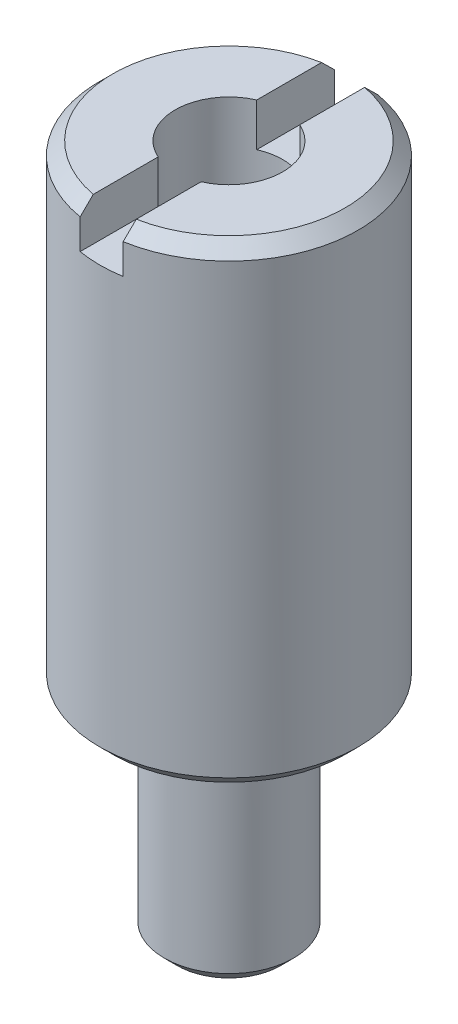
ISO-10303-21;
HEADER;
FILE_DESCRIPTION(('STEP AP214'),'2;1');
FILE_NAME('part.step','',(''),(''),'','','');
FILE_SCHEMA(('AUTOMOTIVE_DESIGN { 1 0 10303 214 1 1 1 1 }'));
ENDSEC;
DATA;
#1=APPLICATION_CONTEXT('core data for automotive mechanical design processes');
#2=APPLICATION_PROTOCOL_DEFINITION('international standard','automotive_design',2000,#1);
#3=PRODUCT_CONTEXT('',#1,'mechanical');
#4=PRODUCT('Part','Part','',(#3));
#5=PRODUCT_RELATED_PRODUCT_CATEGORY('part','',(#4));
#6=PRODUCT_DEFINITION_FORMATION('','',#4);
#7=PRODUCT_DEFINITION_CONTEXT('part definition',#1,'design');
#8=PRODUCT_DEFINITION('design','',#6,#7);
#9=PRODUCT_DEFINITION_SHAPE('','',#8);
#10=(LENGTH_UNIT() NAMED_UNIT(*) SI_UNIT(.MILLI.,.METRE.));
#11=(NAMED_UNIT(*) PLANE_ANGLE_UNIT() SI_UNIT($,.RADIAN.));
#12=(NAMED_UNIT(*) SI_UNIT($,.STERADIAN.) SOLID_ANGLE_UNIT());
#13=UNCERTAINTY_MEASURE_WITH_UNIT(LENGTH_MEASURE(1.E-05),#10,'distance_accuracy_value','');
#14=(GEOMETRIC_REPRESENTATION_CONTEXT(3) GLOBAL_UNCERTAINTY_ASSIGNED_CONTEXT((#13)) GLOBAL_UNIT_ASSIGNED_CONTEXT((#10,
#11,#12)) REPRESENTATION_CONTEXT('',''));
#15=CARTESIAN_POINT('',(0.,0.,0.));
#16=DIRECTION('',(0.,0.,1.));
#17=DIRECTION('',(1.,0.,0.));
#18=AXIS2_PLACEMENT_3D('',#15,#16,#17);
#19=CARTESIAN_POINT('',(0.499999999999999,10.,2.95803989154981));
#20=DIRECTION('',(1.,0.,0.));
#21=DIRECTION('',(0.,1.,0.));
#22=AXIS2_PLACEMENT_3D('',#19,#20,#21);
#23=PLANE('',#22);
#24=DIRECTION('',(0.,0.,-1.));
#25=VECTOR('',#24,1.);
#26=CARTESIAN_POINT('',(0.499999999999999,10.,2.95803989154981));
#27=LINE('',#26,#25);
#28=CARTESIAN_POINT('',(0.499999999999999,10.,-1.14564392373896));
#29=VERTEX_POINT('',#28);
#30=CARTESIAN_POINT('',(0.499999999999999,10.,-2.95803989154981));
#31=VERTEX_POINT('',#30);
#32=EDGE_CURVE('E158',#29,#31,#27,.T.);
#33=ORIENTED_EDGE('',*,*,#32,.F.);
#34=DIRECTION('',(0.,1.,0.));
#35=VECTOR('',#34,1.);
#36=CARTESIAN_POINT('',(0.499999999999999,11.,-1.14564392373896));
#37=LINE('',#36,#35);
#38=CARTESIAN_POINT('',(0.499999999999999,11.,-1.14564392373896));
#39=VERTEX_POINT('',#38);
#40=EDGE_CURVE('E62',#29,#39,#37,.T.);
#41=ORIENTED_EDGE('',*,*,#40,.T.);
#42=DIRECTION('',(0.,0.,-1.));
#43=VECTOR('',#42,1.);
#44=CARTESIAN_POINT('',(0.499999999999999,11.,2.95803989154981));
#45=LINE('',#44,#43);
#46=CARTESIAN_POINT('',(0.499999999999999,11.,-2.65329983228432));
#47=VERTEX_POINT('',#46);
#48=EDGE_CURVE('E166',#39,#47,#45,.T.);
#49=ORIENTED_EDGE('',*,*,#48,.T.);
#50=CARTESIAN_POINT('',(0.499999999999999,10.6993,2.95874981875792));
#51=CARTESIAN_POINT('',(0.499999999999999,10.6993032628081,2.95874650968862));
#52=CARTESIAN_POINT('',(0.499999999999999,10.6993065256161,2.95874320061925));
#53=CARTESIAN_POINT('',(0.499999999999999,10.8027276984309,2.85385567683524));
#54=CARTESIAN_POINT('',(0.499999999999999,10.9060691998332,2.74889605427455));
#55=CARTESIAN_POINT('',(0.499999999999999,11.1125531184051,2.53875236012268));
#56=CARTESIAN_POINT('',(0.499999999999999,11.2156955058096,2.43356825927909));
#57=CARTESIAN_POINT('',(0.499999999999999,11.4220322332499,2.22252850914309));
#58=CARTESIAN_POINT('',(0.499999999999999,11.5252254887443,2.11667179821652));
#59=CARTESIAN_POINT('',(0.499999999999999,11.7310623122136,1.90456567313246));
#60=CARTESIAN_POINT('',(0.499999999999999,11.8337062078894,1.79831657710221));
#61=CARTESIAN_POINT('',(0.499999999999999,12.0373956038889,1.58592959111794));
#62=CARTESIAN_POINT('',(0.499999999999999,12.1384473197591,1.47979768983355));
#63=CARTESIAN_POINT('',(0.499999999999999,12.2890986672922,1.31945809068823));
#64=CARTESIAN_POINT('',(0.499999999999999,12.339227916271,1.26574857588184));
#65=CARTESIAN_POINT('',(0.499999999999999,12.4389588879742,1.15786534379939));
#66=CARTESIAN_POINT('',(0.499999999999999,12.4885607394143,1.10369174589862));
#67=CARTESIAN_POINT('',(0.499999999999999,12.5865258163309,0.995170464365385));
#68=CARTESIAN_POINT('',(0.499999999999999,12.6348963473027,0.940829385805618));
#69=CARTESIAN_POINT('',(0.499999999999999,12.730507671738,0.831056850119869));
#70=CARTESIAN_POINT('',(0.499999999999999,12.7777473154931,0.775624379738064));
#71=CARTESIAN_POINT('',(0.499999999999999,12.8469522960314,0.691332594992195));
#72=CARTESIAN_POINT('',(0.499999999999999,12.8696936634733,0.663112069617232));
#73=CARTESIAN_POINT('',(0.499999999999999,12.9144666617805,0.606115196996294));
#74=CARTESIAN_POINT('',(0.499999999999999,12.936498374947,0.577338914827156));
#75=CARTESIAN_POINT('',(0.499999999999999,12.9795322116046,0.519094038068847));
#76=CARTESIAN_POINT('',(0.499999999999999,13.0005359177478,0.489626618070147));
#77=CARTESIAN_POINT('',(0.499999999999999,13.0410886324597,0.429712199658106));
#78=CARTESIAN_POINT('',(0.499999999999999,13.0606385043995,0.399265798261092));
#79=CARTESIAN_POINT('',(0.499999999999999,13.0841498965911,0.359608218911257));
#80=CARTESIAN_POINT('',(0.499999999999999,13.0891375772727,0.351003983426712));
#81=CARTESIAN_POINT('',(0.499999999999999,13.0989218690113,0.333685658966236));
#82=CARTESIAN_POINT('',(0.499999999999999,13.1037184473827,0.3249715515309));
#83=CARTESIAN_POINT('',(0.499999999999999,13.1177858455721,0.298652870723052));
#84=CARTESIAN_POINT('',(0.499999999999999,13.1267335942264,0.280873163487088));
#85=CARTESIAN_POINT('',(0.499999999999999,13.1434882940614,0.244863071225541));
#86=CARTESIAN_POINT('',(0.499999999999999,13.1512996276926,0.226634752577692));
#87=CARTESIAN_POINT('',(0.499999999999999,13.1655177242567,0.189639976675175));
#88=CARTESIAN_POINT('',(0.499999999999999,13.1719247701478,0.170873628694599));
#89=CARTESIAN_POINT('',(0.499999999999999,13.1858215875976,0.123026906237069));
#90=CARTESIAN_POINT('',(0.499999999999999,13.1921793304307,0.0935963250291287));
#91=CARTESIAN_POINT('',(0.499999999999999,13.1997039897745,0.0340722043892151));
#92=CARTESIAN_POINT('',(0.499999999999999,13.2008761363756,0.0039793637080151));
#93=CARTESIAN_POINT('',(0.499999999999999,13.1977775343522,-0.0558876253264694));
#94=CARTESIAN_POINT('',(0.499999999999999,13.1935103343496,-0.0856619686926777));
#95=CARTESIAN_POINT('',(0.499999999999999,13.1804135385953,-0.144190688790413));
#96=CARTESIAN_POINT('',(0.499999999999999,13.1715750054239,-0.172942949126156));
#97=CARTESIAN_POINT('',(0.499999999999999,13.1478712455945,-0.23650160631182));
#98=CARTESIAN_POINT('',(0.499999999999999,13.132035793255,-0.270933611560776));
#99=CARTESIAN_POINT('',(0.499999999999999,13.0970890618713,-0.338121893066516));
#100=CARTESIAN_POINT('',(0.499999999999999,13.0779702367288,-0.370874078295897));
#101=CARTESIAN_POINT('',(0.499999999999999,13.0375058838782,-0.435352694705371));
#102=CARTESIAN_POINT('',(0.499999999999999,13.0161423182041,-0.467067627645559));
#103=CARTESIAN_POINT('',(0.499999999999999,12.9720772652006,-0.529488419554599));
#104=CARTESIAN_POINT('',(0.499999999999999,12.949377298192,-0.560195365551938));
#105=CARTESIAN_POINT('',(0.499999999999999,12.9003266004614,-0.624466347620693));
#106=CARTESIAN_POINT('',(0.499999999999999,12.8738604549198,-0.657941759772862));
#107=CARTESIAN_POINT('',(0.499999999999999,12.820133587541,-0.724250819788516));
#108=CARTESIAN_POINT('',(0.499999999999999,12.792872775074,-0.75708439373293));
#109=CARTESIAN_POINT('',(0.499999999999999,12.7102371322897,-0.854905532693234));
#110=CARTESIAN_POINT('',(0.499999999999999,12.654029561248,-0.919187544765238));
#111=CARTESIAN_POINT('',(0.499999999999999,12.5403133601899,-1.04675322165754));
#112=CARTESIAN_POINT('',(0.499999999999999,12.4828028817197,-1.11003521972709));
#113=CARTESIAN_POINT('',(0.499999999999999,12.3670338431672,-1.23588309316743));
#114=CARTESIAN_POINT('',(0.499999999999999,12.3087754609212,-1.29844913232354));
#115=CARTESIAN_POINT('',(0.499999999999999,12.19201010214,-1.42284548240621));
#116=CARTESIAN_POINT('',(0.499999999999999,12.1335052515569,-1.48467779473466));
#117=CARTESIAN_POINT('',(0.499999999999999,12.0161467519171,-1.60801716247392));
#118=CARTESIAN_POINT('',(0.499999999999999,11.9572930824697,-1.66952419846447));
#119=CARTESIAN_POINT('',(0.499999999999999,11.7804500418028,-1.85360348601583));
#120=CARTESIAN_POINT('',(0.499999999999999,11.6620940980811,-1.97582333343631));
#121=CARTESIAN_POINT('',(0.499999999999999,11.4734173378781,-2.16977821240794));
#122=CARTESIAN_POINT('',(0.499999999999999,11.4032762685992,-2.24168866149541));
#123=CARTESIAN_POINT('',(0.499999999999999,11.2628344290932,-2.38537389780081));
#124=CARTESIAN_POINT('',(0.499999999999999,11.1925336371922,-2.4571486638447));
#125=CARTESIAN_POINT('',(0.499999999999999,10.9814178654449,-2.67235226850947));
#126=CARTESIAN_POINT('',(0.499999999999999,10.8404336807675,-2.8156150825727));
#127=CARTESIAN_POINT('',(0.499999999999999,10.6993065256161,-2.95874320061925));
#128=CARTESIAN_POINT('',(0.499999999999999,10.6993032628081,-2.95874650968862));
#129=CARTESIAN_POINT('',(0.499999999999999,10.6993,-2.95874981875792));
#130=B_SPLINE_CURVE_WITH_KNOTS('',3,(#50,#51,#52,#53,#54,#55,#56,#57,#58,#59,#60,#61,#62,#63,
#64,#65,#66,#67,#68,#69,#70,#71,#72,#73,#74,#75,#76,#77,#78,#79,#80,#81,#82,#83,#84,#85,#86,#87,
#88,#89,#90,#91,#92,#93,#94,#95,#96,#97,#98,#99,#100,#101,#102,#103,#104,#105,#106,#107,#108,
#109,#110,#111,#112,#113,#114,#115,#116,#117,#118,#119,#120,#121,#122,#123,#124,#125,#126,#127,
#128,#129),.UNSPECIFIED.,.F.,.F.,(4,2,2,2,2,2,2,2,2,2,2,2,2,2,2,2,2,2,2,2,2,2,2,2,2,2,2,2,2,2,2,
2,2,2,2,2,2,2,2,4),(0.,1.39414025392382E-05,0.441900423945657,0.883848514114979,
1.32734532183282,1.77053878390516,2.21016490675432,2.43056904678594,2.6509181002222,
2.86916249458226,3.08762007515377,3.19634206310899,3.30505139644135,3.41358773431733,
3.52205909358646,3.55189302705182,3.58173204148662,3.64141434978097,3.7008600256394,
3.76029371239986,3.85023128461419,3.94007812684971,4.02986638312051,4.11983085185914,
4.23323467850673,4.34690271451209,4.46156643350439,4.57610213872126,4.70410587884228,
4.83212427503449,5.08826019644389,5.3447856044602,5.60125110596169,5.85662073164685,
6.11200543555282,6.62240569418031,6.92376580006528,7.22516958617061,7.82816707820471,
7.82818101960724),.UNSPECIFIED.);
#131=CARTESIAN_POINT('',(0.499999999999999,10.7,-2.95803989154981));
#132=VERTEX_POINT('',#131);
#133=EDGE_CURVE('E209',#47,#132,#130,.T.);
#134=ORIENTED_EDGE('',*,*,#133,.T.);
#135=DIRECTION('',(0.,1.,0.));
#136=VECTOR('',#135,1.);
#137=CARTESIAN_POINT('',(0.499999999999999,10.,-2.95803989154981));
#138=LINE('',#137,#136);
#139=EDGE_CURVE('E169',#31,#132,#138,.T.);
#140=ORIENTED_EDGE('',*,*,#139,.F.);
#141=EDGE_LOOP('',(#33,#41,#49,#134,#140));
#142=FACE_BOUND('',#141,.T.);
#143=ADVANCED_FACE('F46',(#142),#23,.F.);
#144=CARTESIAN_POINT('',(-0.500000000000001,10.,2.95803989154981));
#145=DIRECTION('',(-1.,0.,0.));
#146=DIRECTION('',(0.,-1.,0.));
#147=AXIS2_PLACEMENT_3D('',#144,#145,#146);
#148=PLANE('',#147);
#149=DIRECTION('',(0.,0.,1.));
#150=VECTOR('',#149,1.);
#151=CARTESIAN_POINT('',(-0.500000000000001,10.,2.95803989154981));
#152=LINE('',#151,#150);
#153=CARTESIAN_POINT('',(-0.500000000000001,10.,1.14564392373896));
#154=VERTEX_POINT('',#153);
#155=CARTESIAN_POINT('',(-0.500000000000001,10.,2.95803989154981));
#156=VERTEX_POINT('',#155);
#157=EDGE_CURVE('E151',#154,#156,#152,.T.);
#158=ORIENTED_EDGE('',*,*,#157,.F.);
#159=DIRECTION('',(0.,1.,0.));
#160=VECTOR('',#159,1.);
#161=CARTESIAN_POINT('',(-0.500000000000001,11.,1.14564392373896));
#162=LINE('',#161,#160);
#163=CARTESIAN_POINT('',(-0.500000000000001,11.,1.14564392373896));
#164=VERTEX_POINT('',#163);
#165=EDGE_CURVE('E146',#154,#164,#162,.T.);
#166=ORIENTED_EDGE('',*,*,#165,.T.);
#167=DIRECTION('',(0.,0.,1.));
#168=VECTOR('',#167,1.);
#169=CARTESIAN_POINT('',(-0.500000000000001,11.,2.95803989154981));
#170=LINE('',#169,#168);
#171=CARTESIAN_POINT('',(-0.500000000000001,11.,2.65329983228432));
#172=VERTEX_POINT('',#171);
#173=EDGE_CURVE('E70',#164,#172,#170,.T.);
#174=ORIENTED_EDGE('',*,*,#173,.T.);
#175=CARTESIAN_POINT('',(-0.500000000000001,10.6993,-2.95874981875792));
#176=CARTESIAN_POINT('',(-0.500000000000001,10.6993032628081,-2.95874650968862));
#177=CARTESIAN_POINT('',(-0.500000000000001,10.6993065256161,-2.95874320061925));
#178=CARTESIAN_POINT('',(-0.500000000000001,10.8027276984309,-2.85385567683524));
#179=CARTESIAN_POINT('',(-0.500000000000001,10.9060691998332,-2.74889605427455));
#180=CARTESIAN_POINT('',(-0.500000000000001,11.1125531184051,-2.53875236012268));
#181=CARTESIAN_POINT('',(-0.500000000000001,11.2156955058096,-2.43356825927909));
#182=CARTESIAN_POINT('',(-0.500000000000001,11.4220322332499,-2.22252850914309));
#183=CARTESIAN_POINT('',(-0.500000000000001,11.5252254887443,-2.11667179821651));
#184=CARTESIAN_POINT('',(-0.500000000000001,11.7310623122136,-1.90456567313246));
#185=CARTESIAN_POINT('',(-0.500000000000001,11.8337062078894,-1.79831657710221));
#186=CARTESIAN_POINT('',(-0.500000000000001,12.0373956038889,-1.58592959111794));
#187=CARTESIAN_POINT('',(-0.500000000000001,12.1384473197591,-1.47979768983355));
#188=CARTESIAN_POINT('',(-0.500000000000001,12.2890986672922,-1.31945809068823));
#189=CARTESIAN_POINT('',(-0.500000000000001,12.339227916271,-1.26574857588184));
#190=CARTESIAN_POINT('',(-0.500000000000001,12.4389588879742,-1.15786534379939));
#191=CARTESIAN_POINT('',(-0.500000000000001,12.4885607394143,-1.10369174589862));
#192=CARTESIAN_POINT('',(-0.500000000000001,12.5865258163309,-0.995170464365382));
#193=CARTESIAN_POINT('',(-0.500000000000001,12.6348963473027,-0.940829385805615));
#194=CARTESIAN_POINT('',(-0.500000000000001,12.730507671738,-0.831056850119866));
#195=CARTESIAN_POINT('',(-0.500000000000001,12.7777473154931,-0.775624379738061));
#196=CARTESIAN_POINT('',(-0.500000000000001,12.8469522960314,-0.691332594992193));
#197=CARTESIAN_POINT('',(-0.500000000000001,12.8696936634733,-0.66311206961723));
#198=CARTESIAN_POINT('',(-0.500000000000001,12.9144666617805,-0.606115196996292));
#199=CARTESIAN_POINT('',(-0.500000000000001,12.936498374947,-0.577338914827154));
#200=CARTESIAN_POINT('',(-0.500000000000001,12.9795322116046,-0.519094038068845));
#201=CARTESIAN_POINT('',(-0.500000000000001,13.0005359177478,-0.489626618070145));
#202=CARTESIAN_POINT('',(-0.500000000000001,13.0410886324597,-0.429712199658105));
#203=CARTESIAN_POINT('',(-0.500000000000001,13.0606385043995,-0.399265798261091));
#204=CARTESIAN_POINT('',(-0.500000000000001,13.0841498965911,-0.359608218911255));
#205=CARTESIAN_POINT('',(-0.500000000000001,13.0891375772727,-0.351003983426709));
#206=CARTESIAN_POINT('',(-0.500000000000001,13.0989218690113,-0.333685658966233));
#207=CARTESIAN_POINT('',(-0.500000000000001,13.1037184473827,-0.324971551530896));
#208=CARTESIAN_POINT('',(-0.500000000000001,13.1177858455721,-0.298652870723048));
#209=CARTESIAN_POINT('',(-0.500000000000001,13.1267335942264,-0.280873163487084));
#210=CARTESIAN_POINT('',(-0.500000000000001,13.1434882940614,-0.244863071225538));
#211=CARTESIAN_POINT('',(-0.500000000000001,13.1512996276926,-0.226634752577689));
#212=CARTESIAN_POINT('',(-0.500000000000001,13.1655177242567,-0.189639976675173));
#213=CARTESIAN_POINT('',(-0.500000000000001,13.1719247701478,-0.170873628694597));
#214=CARTESIAN_POINT('',(-0.500000000000001,13.1858215875976,-0.123026906237068));
#215=CARTESIAN_POINT('',(-0.500000000000001,13.1921793304307,-0.093596325029127));
#216=CARTESIAN_POINT('',(-0.500000000000001,13.1997039897745,-0.0340722043892132));
#217=CARTESIAN_POINT('',(-0.500000000000001,13.2008761363756,-0.00397936370801301));
#218=CARTESIAN_POINT('',(-0.500000000000001,13.1977775343522,0.0558876253264723));
#219=CARTESIAN_POINT('',(-0.500000000000001,13.1935103343496,0.0856619686926813));
#220=CARTESIAN_POINT('',(-0.500000000000001,13.1804135385953,0.144190688790417));
#221=CARTESIAN_POINT('',(-0.500000000000001,13.1715750054239,0.172942949126159));
#222=CARTESIAN_POINT('',(-0.500000000000001,13.1478712455945,0.236501606311822));
#223=CARTESIAN_POINT('',(-0.500000000000001,13.132035793255,0.270933611560777));
#224=CARTESIAN_POINT('',(-0.500000000000001,13.0970890618713,0.338121893066515));
#225=CARTESIAN_POINT('',(-0.500000000000001,13.0779702367288,0.370874078295895));
#226=CARTESIAN_POINT('',(-0.500000000000001,13.0375058838782,0.43535269470537));
#227=CARTESIAN_POINT('',(-0.500000000000001,13.0161423182041,0.46706762764556));
#228=CARTESIAN_POINT('',(-0.500000000000001,12.9720772652006,0.529488419554603));
#229=CARTESIAN_POINT('',(-0.500000000000001,12.949377298192,0.560195365551945));
#230=CARTESIAN_POINT('',(-0.500000000000001,12.9003266004614,0.624466347620704));
#231=CARTESIAN_POINT('',(-0.500000000000001,12.8738604549197,0.657941759772875));
#232=CARTESIAN_POINT('',(-0.500000000000001,12.820133587541,0.724250819788534));
#233=CARTESIAN_POINT('',(-0.500000000000001,12.792872775074,0.75708439373295));
#234=CARTESIAN_POINT('',(-0.500000000000001,12.7102371322897,0.854905532693261));
#235=CARTESIAN_POINT('',(-0.500000000000001,12.654029561248,0.919187544765271));
#236=CARTESIAN_POINT('',(-0.500000000000001,12.5403133601898,1.04675322165758));
#237=CARTESIAN_POINT('',(-0.500000000000001,12.4828028817196,1.11003521972714));
#238=CARTESIAN_POINT('',(-0.500000000000001,12.3670338431671,1.23588309316747));
#239=CARTESIAN_POINT('',(-0.500000000000001,12.3087754609212,1.29844913232359));
#240=CARTESIAN_POINT('',(-0.500000000000001,12.19201010214,1.42284548240626));
#241=CARTESIAN_POINT('',(-0.500000000000001,12.1335052515569,1.48467779473471));
#242=CARTESIAN_POINT('',(-0.500000000000001,12.016146751917,1.60801716247397));
#243=CARTESIAN_POINT('',(-0.500000000000001,11.9572930824696,1.66952419846451));
#244=CARTESIAN_POINT('',(-0.500000000000001,11.7804500418028,1.85360348601588));
#245=CARTESIAN_POINT('',(-0.500000000000001,11.6620940980811,1.97582333343639));
#246=CARTESIAN_POINT('',(-0.500000000000001,11.473417337878,2.16977821240795));
#247=CARTESIAN_POINT('',(-0.500000000000001,11.4032762685991,2.24168866149536));
#248=CARTESIAN_POINT('',(-0.500000000000001,11.2628344290933,2.38537389780091));
#249=CARTESIAN_POINT('',(-0.500000000000001,11.1925336371925,2.45714866384499));
#250=CARTESIAN_POINT('',(-0.500000000000001,10.9814178654444,2.67235226850892));
#251=CARTESIAN_POINT('',(-0.500000000000001,10.8404336807644,2.81561508256962));
#252=CARTESIAN_POINT('',(-0.500000000000001,10.6993065256161,2.95874320061925));
#253=CARTESIAN_POINT('',(-0.500000000000001,10.6993032628081,2.95874650968862));
#254=CARTESIAN_POINT('',(-0.500000000000001,10.6993,2.95874981875792));
#255=B_SPLINE_CURVE_WITH_KNOTS('',3,(#175,#176,#177,#178,#179,#180,#181,#182,#183,#184,#185,
#186,#187,#188,#189,#190,#191,#192,#193,#194,#195,#196,#197,#198,#199,#200,#201,#202,#203,#204,
#205,#206,#207,#208,#209,#210,#211,#212,#213,#214,#215,#216,#217,#218,#219,#220,#221,#222,#223,
#224,#225,#226,#227,#228,#229,#230,#231,#232,#233,#234,#235,#236,#237,#238,#239,#240,#241,#242,
#243,#244,#245,#246,#247,#248,#249,#250,#251,#252,#253,#254),.UNSPECIFIED.,.F.,.F.,(4,2,2,2,2,2,
2,2,2,2,2,2,2,2,2,2,2,2,2,2,2,2,2,2,2,2,2,2,2,2,2,2,2,2,2,2,2,2,2,4),(0.,1.39414025392382E-05,
0.441900423945657,0.883848514114979,1.32734532183282,1.77053878390516,2.21016490675432,
2.43056904678595,2.6509181002222,2.86916249458227,3.08762007515377,3.19634206310899,
3.30505139644135,3.41358773431734,3.52205909358646,3.55189302705182,3.58173204148662,
3.64141434978097,3.7008600256394,3.76029371239986,3.85023128461419,3.94007812684971,
4.02986638312051,4.11983085185914,4.23323467850673,4.34690271451209,4.46156643350439,
4.57610213872127,4.7041058788423,4.83212427503452,5.08826019644394,5.34478560446026,
5.60125110596177,5.85662073164692,6.11200543555288,6.62240569418035,6.92376580006531,
7.22516958617062,7.8281670782047,7.82818101960724),.UNSPECIFIED.);
#256=CARTESIAN_POINT('',(-0.500000000000001,10.7,2.95803989154981));
#257=VERTEX_POINT('',#256);
#258=EDGE_CURVE('E201',#172,#257,#255,.T.);
#259=ORIENTED_EDGE('',*,*,#258,.T.);
#260=DIRECTION('',(0.,1.,0.));
#261=VECTOR('',#260,1.);
#262=CARTESIAN_POINT('',(-0.500000000000001,10.,2.95803989154981));
#263=LINE('',#262,#261);
#264=EDGE_CURVE('E175',#156,#257,#263,.T.);
#265=ORIENTED_EDGE('',*,*,#264,.F.);
#266=EDGE_LOOP('',(#158,#166,#174,#259,#265));
#267=FACE_BOUND('',#266,.T.);
#268=ADVANCED_FACE('F226',(#267),#148,.F.);
#269=CARTESIAN_POINT('',(0.,10.,0.));
#270=DIRECTION('',(0.,1.,0.));
#271=DIRECTION('',(-1.,0.,0.));
#272=AXIS2_PLACEMENT_3D('',#269,#270,#271);
#273=PLANE('',#272);
#274=CARTESIAN_POINT('',(0.,10.,0.));
#275=DIRECTION('',(0.,1.,0.));
#276=DIRECTION('',(-1.,0.,0.));
#277=AXIS2_PLACEMENT_3D('',#274,#275,#276);
#278=CIRCLE('',#277,1.25);
#279=CARTESIAN_POINT('',(0.499999999999999,10.,1.14564392373896));
#280=VERTEX_POINT('',#279);
#281=EDGE_CURVE('E11',#154,#280,#278,.T.);
#282=ORIENTED_EDGE('',*,*,#281,.F.);
#283=ORIENTED_EDGE('',*,*,#157,.T.);
#284=CARTESIAN_POINT('',(0.,10.,0.));
#285=DIRECTION('',(0.,1.,0.));
#286=DIRECTION('',(-1.,0.,0.));
#287=AXIS2_PLACEMENT_3D('',#284,#285,#286);
#288=CIRCLE('',#287,3.);
#289=CARTESIAN_POINT('',(0.499999999999999,10.,2.95803989154981));
#290=VERTEX_POINT('',#289);
#291=EDGE_CURVE('E156',#156,#290,#288,.T.);
#292=ORIENTED_EDGE('',*,*,#291,.T.);
#293=EDGE_CURVE('E159',#290,#280,#27,.T.);
#294=ORIENTED_EDGE('',*,*,#293,.T.);
#295=EDGE_LOOP('',(#282,#283,#292,#294));
#296=FACE_BOUND('',#295,.T.);
#297=ADVANCED_FACE('F258',(#296),#273,.T.);
#298=CARTESIAN_POINT('',(-3.,11.,0.));
#299=DIRECTION('',(0.,1.,0.));
#300=DIRECTION('',(-1.,0.,0.));
#301=AXIS2_PLACEMENT_3D('',#298,#299,#300);
#302=PLANE('',#301);
#303=CARTESIAN_POINT('',(0.,11.,0.));
#304=DIRECTION('',(0.,1.,0.));
#305=DIRECTION('',(0.,0.,1.));
#306=AXIS2_PLACEMENT_3D('',#303,#304,#305);
#307=CIRCLE('',#306,1.25);
#308=CARTESIAN_POINT('',(0.499999999999999,11.,1.14564392373896));
#309=VERTEX_POINT('',#308);
#310=EDGE_CURVE('E135',#309,#39,#307,.T.);
#311=ORIENTED_EDGE('',*,*,#310,.F.);
#312=CARTESIAN_POINT('',(0.499999999999999,11.,2.65329983228432));
#313=VERTEX_POINT('',#312);
#314=EDGE_CURVE('E152',#313,#309,#45,.T.);
#315=ORIENTED_EDGE('',*,*,#314,.F.);
#316=CARTESIAN_POINT('',(0.,11.,0.));
#317=DIRECTION('',(0.,1.,0.));
#318=DIRECTION('',(-1.,0.,0.));
#319=AXIS2_PLACEMENT_3D('',#316,#317,#318);
#320=CIRCLE('',#319,2.7);
#321=EDGE_CURVE('E184',#313,#47,#320,.T.);
#322=ORIENTED_EDGE('',*,*,#321,.T.);
#323=ORIENTED_EDGE('',*,*,#48,.F.);
#324=EDGE_LOOP('',(#311,#315,#322,#323));
#325=FACE_BOUND('',#324,.T.);
#326=ADVANCED_FACE('F234',(#325),#302,.T.);
#327=CARTESIAN_POINT('',(0.,11.,0.));
#328=DIRECTION('',(0.,-1.,0.));
#329=DIRECTION('',(1.,0.,0.));
#330=AXIS2_PLACEMENT_3D('',#327,#328,#329);
#331=CONICAL_SURFACE('',#330,2.7,0.785398163397449);
#332=CARTESIAN_POINT('',(0.499999999999999,10.7,2.95803989154981));
#333=VERTEX_POINT('',#332);
#334=EDGE_CURVE('E270',#333,#313,#130,.T.);
#335=ORIENTED_EDGE('',*,*,#334,.F.);
#336=CARTESIAN_POINT('',(0.,10.7,0.));
#337=DIRECTION('',(0.,1.,0.));
#338=DIRECTION('',(-1.,0.,0.));
#339=AXIS2_PLACEMENT_3D('',#336,#337,#338);
#340=CIRCLE('',#339,3.);
#341=EDGE_CURVE('E191',#132,#333,#340,.F.);
#342=ORIENTED_EDGE('',*,*,#341,.F.);
#343=ORIENTED_EDGE('',*,*,#133,.F.);
#344=ORIENTED_EDGE('',*,*,#321,.F.);
#345=EDGE_LOOP('',(#335,#342,#343,#344));
#346=FACE_BOUND('',#345,.T.);
#347=ADVANCED_FACE('F247',(#346),#331,.T.);
#348=CARTESIAN_POINT('',(0.,-5.,0.));
#349=DIRECTION('',(0.,-1.,0.));
#350=DIRECTION('',(1.,0.,0.));
#351=AXIS2_PLACEMENT_3D('',#348,#349,#350);
#352=PLANE('',#351);
#353=CARTESIAN_POINT('',(0.,-5.,0.));
#354=DIRECTION('',(0.,-1.,0.));
#355=DIRECTION('',(1.,0.,0.));
#356=AXIS2_PLACEMENT_3D('',#353,#354,#355);
#357=CIRCLE('',#356,1.2);
#358=CARTESIAN_POINT('',(1.2,-5.,0.));
#359=VERTEX_POINT('',#358);
#360=EDGE_CURVE('E198',#359,#359,#357,.T.);
#361=ORIENTED_EDGE('',*,*,#360,.T.);
#362=EDGE_LOOP('',(#361));
#363=FACE_BOUND('',#362,.T.);
#364=ADVANCED_FACE('F244',(#363),#352,.T.);
#365=CARTESIAN_POINT('',(0.,16.004822161942,0.));
#366=DIRECTION('',(0.,1.,0.));
#367=DIRECTION('',(-1.,0.,0.));
#368=AXIS2_PLACEMENT_3D('',#365,#366,#367);
#369=CYLINDRICAL_SURFACE('',#368,1.5);
#370=CARTESIAN_POINT('',(0.,-4.7,0.));
#371=DIRECTION('',(0.,-1.,0.));
#372=DIRECTION('',(1.,0.,0.));
#373=AXIS2_PLACEMENT_3D('',#370,#371,#372);
#374=CIRCLE('',#373,1.5);
#375=CARTESIAN_POINT('',(1.5,-4.7,0.));
#376=VERTEX_POINT('',#375);
#377=EDGE_CURVE('E195',#376,#376,#374,.F.);
#378=ORIENTED_EDGE('',*,*,#377,.T.);
#379=EDGE_LOOP('',(#378));
#380=FACE_BOUND('',#379,.T.);
#381=CARTESIAN_POINT('',(0.,0.,0.));
#382=DIRECTION('',(0.,1.,0.));
#383=DIRECTION('',(-1.,0.,0.));
#384=AXIS2_PLACEMENT_3D('',#381,#382,#383);
#385=CIRCLE('',#384,1.5);
#386=CARTESIAN_POINT('',(-1.5,0.,0.));
#387=VERTEX_POINT('',#386);
#388=EDGE_CURVE('E172',#387,#387,#385,.T.);
#389=ORIENTED_EDGE('',*,*,#388,.F.);
#390=EDGE_LOOP('',(#389));
#391=FACE_BOUND('',#390,.T.);
#392=ADVANCED_FACE('F241',(#380,#391),#369,.T.);
#393=CARTESIAN_POINT('',(-1.5,0.,0.));
#394=DIRECTION('',(0.,-1.,0.));
#395=DIRECTION('',(1.,0.,0.));
#396=AXIS2_PLACEMENT_3D('',#393,#394,#395);
#397=PLANE('',#396);
#398=CARTESIAN_POINT('',(0.,0.,0.));
#399=DIRECTION('',(0.,-1.,0.));
#400=DIRECTION('',(1.,0.,0.));
#401=AXIS2_PLACEMENT_3D('',#398,#399,#400);
#402=CIRCLE('',#401,2.7);
#403=CARTESIAN_POINT('',(2.7,0.,0.));
#404=VERTEX_POINT('',#403);
#405=EDGE_CURVE('E192',#404,#404,#402,.T.);
#406=ORIENTED_EDGE('',*,*,#405,.T.);
#407=EDGE_LOOP('',(#406));
#408=FACE_BOUND('',#407,.T.);
#409=ORIENTED_EDGE('',*,*,#388,.T.);
#410=EDGE_LOOP('',(#409));
#411=FACE_BOUND('',#410,.T.);
#412=ADVANCED_FACE('F237',(#408,#411),#397,.T.);
#413=CARTESIAN_POINT('',(0.,16.004822161942,0.));
#414=DIRECTION('',(0.,1.,0.));
#415=DIRECTION('',(-1.,0.,0.));
#416=AXIS2_PLACEMENT_3D('',#413,#414,#415);
#417=CYLINDRICAL_SURFACE('',#416,3.);
#418=ORIENTED_EDGE('',*,*,#139,.T.);
#419=ORIENTED_EDGE('',*,*,#341,.T.);
#420=DIRECTION('',(0.,1.,0.));
#421=VECTOR('',#420,1.);
#422=CARTESIAN_POINT('',(0.499999999999999,10.,2.95803989154981));
#423=LINE('',#422,#421);
#424=EDGE_CURVE('E173',#290,#333,#423,.T.);
#425=ORIENTED_EDGE('',*,*,#424,.F.);
#426=ORIENTED_EDGE('',*,*,#291,.F.);
#427=ORIENTED_EDGE('',*,*,#264,.T.);
#428=CARTESIAN_POINT('',(-0.500000000000001,10.7,-2.95803989154981));
#429=VERTEX_POINT('',#428);
#430=EDGE_CURVE('E188',#257,#429,#340,.F.);
#431=ORIENTED_EDGE('',*,*,#430,.T.);
#432=DIRECTION('',(0.,1.,0.));
#433=VECTOR('',#432,1.);
#434=CARTESIAN_POINT('',(-0.500000000000001,10.,-2.95803989154981));
#435=LINE('',#434,#433);
#436=CARTESIAN_POINT('',(-0.500000000000001,10.,-2.95803989154981));
#437=VERTEX_POINT('',#436);
#438=EDGE_CURVE('E162',#437,#429,#435,.T.);
#439=ORIENTED_EDGE('',*,*,#438,.F.);
#440=CARTESIAN_POINT('',(0.,10.,0.));
#441=DIRECTION('',(0.,1.,0.));
#442=DIRECTION('',(-1.,0.,0.));
#443=AXIS2_PLACEMENT_3D('',#440,#441,#442);
#444=CIRCLE('',#443,3.);
#445=EDGE_CURVE('E148',#31,#437,#444,.T.);
#446=ORIENTED_EDGE('',*,*,#445,.F.);
#447=EDGE_LOOP('',(#418,#419,#425,#426,#427,#431,#439,#446));
#448=FACE_BOUND('',#447,.T.);
#449=CARTESIAN_POINT('',(0.,0.299999999999998,0.));
#450=DIRECTION('',(0.,-1.,0.));
#451=DIRECTION('',(1.,0.,0.));
#452=AXIS2_PLACEMENT_3D('',#449,#450,#451);
#453=CIRCLE('',#452,3.);
#454=CARTESIAN_POINT('',(3.,0.299999999999998,0.));
#455=VERTEX_POINT('',#454);
#456=EDGE_CURVE('E185',#455,#455,#453,.F.);
#457=ORIENTED_EDGE('',*,*,#456,.T.);
#458=EDGE_LOOP('',(#457));
#459=FACE_BOUND('',#458,.T.);
#460=ADVANCED_FACE('F232',(#448,#459),#417,.T.);
#461=CARTESIAN_POINT('',(-0.500000000000001,11.,-1.14564392373896));
#462=VERTEX_POINT('',#461);
#463=EDGE_CURVE('E139',#462,#164,#307,.T.);
#464=ORIENTED_EDGE('',*,*,#463,.F.);
#465=CARTESIAN_POINT('',(-0.500000000000001,11.,-2.65329983228432));
#466=VERTEX_POINT('',#465);
#467=EDGE_CURVE('E163',#466,#462,#170,.T.);
#468=ORIENTED_EDGE('',*,*,#467,.F.);
#469=EDGE_CURVE('E181',#466,#172,#320,.T.);
#470=ORIENTED_EDGE('',*,*,#469,.T.);
#471=ORIENTED_EDGE('',*,*,#173,.F.);
#472=EDGE_LOOP('',(#464,#468,#470,#471));
#473=FACE_BOUND('',#472,.T.);
#474=ADVANCED_FACE('F229',(#473),#302,.T.);
#475=EDGE_CURVE('E208',#429,#466,#255,.T.);
#476=ORIENTED_EDGE('',*,*,#475,.F.);
#477=ORIENTED_EDGE('',*,*,#430,.F.);
#478=ORIENTED_EDGE('',*,*,#258,.F.);
#479=ORIENTED_EDGE('',*,*,#469,.F.);
#480=EDGE_LOOP('',(#476,#477,#478,#479));
#481=FACE_BOUND('',#480,.T.);
#482=ADVANCED_FACE('F216',(#481),#331,.T.);
#483=CARTESIAN_POINT('',(0.,0.299999999999998,0.));
#484=DIRECTION('',(0.,1.,0.));
#485=DIRECTION('',(-1.,0.,0.));
#486=AXIS2_PLACEMENT_3D('',#483,#484,#485);
#487=CONICAL_SURFACE('',#486,3.,0.785398163397452);
#488=ORIENTED_EDGE('',*,*,#405,.F.);
#489=EDGE_LOOP('',(#488));
#490=FACE_BOUND('',#489,.T.);
#491=ORIENTED_EDGE('',*,*,#456,.F.);
#492=EDGE_LOOP('',(#491));
#493=FACE_BOUND('',#492,.T.);
#494=ADVANCED_FACE('F265',(#490,#493),#487,.T.);
#495=CARTESIAN_POINT('',(0.,-4.7,0.));
#496=DIRECTION('',(0.,1.,0.));
#497=DIRECTION('',(-1.,0.,0.));
#498=AXIS2_PLACEMENT_3D('',#495,#496,#497);
#499=CONICAL_SURFACE('',#498,1.5,0.785398163397448);
#500=ORIENTED_EDGE('',*,*,#360,.F.);
#501=EDGE_LOOP('',(#500));
#502=FACE_BOUND('',#501,.T.);
#503=ORIENTED_EDGE('',*,*,#377,.F.);
#504=EDGE_LOOP('',(#503));
#505=FACE_BOUND('',#504,.T.);
#506=ADVANCED_FACE('F49',(#502,#505),#499,.T.);
#507=ORIENTED_EDGE('',*,*,#314,.T.);
#508=DIRECTION('',(0.,1.,0.));
#509=VECTOR('',#508,1.);
#510=CARTESIAN_POINT('',(0.499999999999999,11.,1.14564392373896));
#511=LINE('',#510,#509);
#512=EDGE_CURVE('E143',#309,#280,#511,.F.);
#513=ORIENTED_EDGE('',*,*,#512,.T.);
#514=ORIENTED_EDGE('',*,*,#293,.F.);
#515=ORIENTED_EDGE('',*,*,#424,.T.);
#516=ORIENTED_EDGE('',*,*,#334,.T.);
#517=EDGE_LOOP('',(#507,#513,#514,#515,#516));
#518=FACE_BOUND('',#517,.T.);
#519=ADVANCED_FACE('F224',(#518),#23,.F.);
#520=ORIENTED_EDGE('',*,*,#467,.T.);
#521=DIRECTION('',(0.,1.,0.));
#522=VECTOR('',#521,1.);
#523=CARTESIAN_POINT('',(-0.500000000000001,11.,-1.14564392373896));
#524=LINE('',#523,#522);
#525=CARTESIAN_POINT('',(-0.500000000000001,10.,-1.14564392373896));
#526=VERTEX_POINT('',#525);
#527=EDGE_CURVE('E134',#462,#526,#524,.F.);
#528=ORIENTED_EDGE('',*,*,#527,.T.);
#529=EDGE_CURVE('E153',#437,#526,#152,.T.);
#530=ORIENTED_EDGE('',*,*,#529,.F.);
#531=ORIENTED_EDGE('',*,*,#438,.T.);
#532=ORIENTED_EDGE('',*,*,#475,.T.);
#533=EDGE_LOOP('',(#520,#528,#530,#531,#532));
#534=FACE_BOUND('',#533,.T.);
#535=ADVANCED_FACE('F219',(#534),#148,.F.);
#536=EDGE_CURVE('E51',#29,#526,#278,.T.);
#537=ORIENTED_EDGE('',*,*,#536,.F.);
#538=ORIENTED_EDGE('',*,*,#32,.T.);
#539=ORIENTED_EDGE('',*,*,#445,.T.);
#540=ORIENTED_EDGE('',*,*,#529,.T.);
#541=EDGE_LOOP('',(#537,#538,#539,#540));
#542=FACE_BOUND('',#541,.T.);
#543=ADVANCED_FACE('F223',(#542),#273,.T.);
#544=CARTESIAN_POINT('',(0.,11.,0.));
#545=DIRECTION('',(0.,1.,0.));
#546=DIRECTION('',(0.,0.,1.));
#547=AXIS2_PLACEMENT_3D('',#544,#545,#546);
#548=CYLINDRICAL_SURFACE('',#547,1.25);
#549=CARTESIAN_POINT('',(0.,2.5,0.));
#550=DIRECTION('',(0.,1.,0.));
#551=DIRECTION('',(0.,0.,1.));
#552=AXIS2_PLACEMENT_3D('',#549,#550,#551);
#553=CIRCLE('',#552,1.25);
#554=CARTESIAN_POINT('',(0.,2.5,1.25));
#555=VERTEX_POINT('',#554);
#556=EDGE_CURVE('E132',#555,#555,#553,.T.);
#557=ORIENTED_EDGE('',*,*,#556,.F.);
#558=EDGE_LOOP('',(#557));
#559=FACE_BOUND('',#558,.T.);
#560=ORIENTED_EDGE('',*,*,#281,.T.);
#561=ORIENTED_EDGE('',*,*,#512,.F.);
#562=ORIENTED_EDGE('',*,*,#310,.T.);
#563=ORIENTED_EDGE('',*,*,#40,.F.);
#564=ORIENTED_EDGE('',*,*,#536,.T.);
#565=ORIENTED_EDGE('',*,*,#527,.F.);
#566=ORIENTED_EDGE('',*,*,#463,.T.);
#567=ORIENTED_EDGE('',*,*,#165,.F.);
#568=EDGE_LOOP('',(#560,#561,#562,#563,#564,#565,#566,#567));
#569=FACE_BOUND('',#568,.T.);
#570=ADVANCED_FACE('F128',(#559,#569),#548,.F.);
#571=CARTESIAN_POINT('',(0.,2.5,0.));
#572=DIRECTION('',(0.,1.,0.));
#573=DIRECTION('',(0.,0.,1.));
#574=AXIS2_PLACEMENT_3D('',#571,#572,#573);
#575=CONICAL_SURFACE('',#574,1.25,1.02974425867665);
#576=CARTESIAN_POINT('',(0.,1.74892422621555,0.));
#577=VERTEX_POINT('',#576);
#578=VERTEX_LOOP('',#577);
#579=FACE_BOUND('',#578,.T.);
#580=ORIENTED_EDGE('',*,*,#556,.T.);
#581=EDGE_LOOP('',(#580));
#582=FACE_BOUND('',#581,.T.);
#583=ADVANCED_FACE('F125',(#579,#582),#575,.F.);
#584=CLOSED_SHELL('',(#143,#268,#297,#326,#347,#364,#392,#412,#460,#474,#482,#494,#506,#519,
#535,#543,#570,#583));
#585=MANIFOLD_SOLID_BREP('B2',#584);
#586=ADVANCED_BREP_SHAPE_REPRESENTATION('',(#18,#585),#14);
#587=SHAPE_DEFINITION_REPRESENTATION(#9,#586);
ENDSEC;
END-ISO-10303-21;
